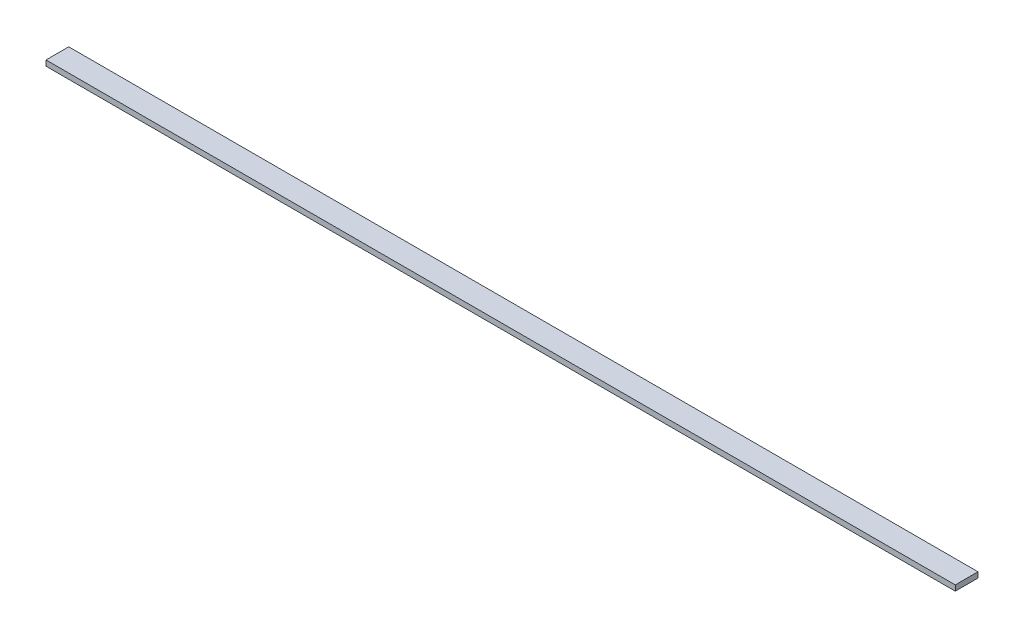
ISO-10303-21;
HEADER;
FILE_DESCRIPTION(('STEP AP214'),'2;1');
FILE_NAME('part.step','',(''),(''),'','','');
FILE_SCHEMA(('AUTOMOTIVE_DESIGN { 1 0 10303 214 1 1 1 1 }'));
ENDSEC;
DATA;
#1=APPLICATION_CONTEXT('core data for automotive mechanical design processes');
#2=APPLICATION_PROTOCOL_DEFINITION('international standard','automotive_design',2000,#1);
#3=PRODUCT_CONTEXT('',#1,'mechanical');
#4=PRODUCT('Part','Part','',(#3));
#5=PRODUCT_RELATED_PRODUCT_CATEGORY('part','',(#4));
#6=PRODUCT_DEFINITION_FORMATION('','',#4);
#7=PRODUCT_DEFINITION_CONTEXT('part definition',#1,'design');
#8=PRODUCT_DEFINITION('design','',#6,#7);
#9=PRODUCT_DEFINITION_SHAPE('','',#8);
#10=(LENGTH_UNIT() NAMED_UNIT(*) SI_UNIT(.MILLI.,.METRE.));
#11=(NAMED_UNIT(*) PLANE_ANGLE_UNIT() SI_UNIT($,.RADIAN.));
#12=(NAMED_UNIT(*) SI_UNIT($,.STERADIAN.) SOLID_ANGLE_UNIT());
#13=UNCERTAINTY_MEASURE_WITH_UNIT(LENGTH_MEASURE(1.E-05),#10,'distance_accuracy_value','');
#14=(GEOMETRIC_REPRESENTATION_CONTEXT(3) GLOBAL_UNCERTAINTY_ASSIGNED_CONTEXT((#13)) GLOBAL_UNIT_ASSIGNED_CONTEXT((#10,
#11,#12)) REPRESENTATION_CONTEXT('',''));
#15=CARTESIAN_POINT('',(0.,0.,0.));
#16=DIRECTION('',(0.,0.,1.));
#17=DIRECTION('',(1.,0.,0.));
#18=AXIS2_PLACEMENT_3D('',#15,#16,#17);
#19=CARTESIAN_POINT('',(-75.9433007859229,6.,-31.6632072793595));
#20=DIRECTION('',(1.,0.,0.));
#21=DIRECTION('',(0.,0.,-1.));
#22=AXIS2_PLACEMENT_3D('',#19,#20,#21);
#23=PLANE('',#22);
#24=DIRECTION('',(0.,0.,1.));
#25=VECTOR('',#24,1.);
#26=CARTESIAN_POINT('',(-75.9433007859229,0.,-31.6632072793595));
#27=LINE('',#26,#25);
#28=CARTESIAN_POINT('',(-75.9433007859229,0.,-31.6632072793595));
#29=VERTEX_POINT('',#28);
#30=CARTESIAN_POINT('',(-75.9433007859229,0.,-6.66320727935954));
#31=VERTEX_POINT('',#30);
#32=EDGE_CURVE('E96',#29,#31,#27,.T.);
#33=ORIENTED_EDGE('',*,*,#32,.T.);
#34=DIRECTION('',(0.,-1.,0.));
#35=VECTOR('',#34,1.);
#36=CARTESIAN_POINT('',(-75.9433007859229,6.,-6.66320727935954));
#37=LINE('',#36,#35);
#38=CARTESIAN_POINT('',(-75.9433007859229,6.,-6.66320727935954));
#39=VERTEX_POINT('',#38);
#40=EDGE_CURVE('E11',#39,#31,#37,.T.);
#41=ORIENTED_EDGE('',*,*,#40,.F.);
#42=DIRECTION('',(0.,0.,1.));
#43=VECTOR('',#42,1.);
#44=CARTESIAN_POINT('',(-75.9433007859229,6.,-31.6632072793595));
#45=LINE('',#44,#43);
#46=CARTESIAN_POINT('',(-75.9433007859229,6.,-31.6632072793595));
#47=VERTEX_POINT('',#46);
#48=EDGE_CURVE('E84',#47,#39,#45,.T.);
#49=ORIENTED_EDGE('',*,*,#48,.F.);
#50=DIRECTION('',(0.,-1.,0.));
#51=VECTOR('',#50,1.);
#52=CARTESIAN_POINT('',(-75.9433007859229,6.,-31.6632072793595));
#53=LINE('',#52,#51);
#54=EDGE_CURVE('E92',#47,#29,#53,.T.);
#55=ORIENTED_EDGE('',*,*,#54,.T.);
#56=EDGE_LOOP('',(#33,#41,#49,#55));
#57=FACE_BOUND('',#56,.T.);
#58=ADVANCED_FACE('F33',(#57),#23,.F.);
#59=CARTESIAN_POINT('',(-75.9433007859229,6.,-6.66320727935954));
#60=DIRECTION('',(0.,0.,-1.));
#61=DIRECTION('',(-1.,0.,0.));
#62=AXIS2_PLACEMENT_3D('',#59,#60,#61);
#63=PLANE('',#62);
#64=DIRECTION('',(1.,0.,0.));
#65=VECTOR('',#64,1.);
#66=CARTESIAN_POINT('',(-75.9433007859229,0.,-6.66320727935954));
#67=LINE('',#66,#65);
#68=CARTESIAN_POINT('',(924.056699214077,0.,-6.66320727935954));
#69=VERTEX_POINT('',#68);
#70=EDGE_CURVE('E88',#31,#69,#67,.T.);
#71=ORIENTED_EDGE('',*,*,#70,.T.);
#72=DIRECTION('',(0.,-1.,0.));
#73=VECTOR('',#72,1.);
#74=CARTESIAN_POINT('',(924.056699214077,6.,-6.66320727935954));
#75=LINE('',#74,#73);
#76=CARTESIAN_POINT('',(924.056699214077,6.,-6.66320727935954));
#77=VERTEX_POINT('',#76);
#78=EDGE_CURVE('E41',#77,#69,#75,.T.);
#79=ORIENTED_EDGE('',*,*,#78,.F.);
#80=DIRECTION('',(1.,0.,0.));
#81=VECTOR('',#80,1.);
#82=CARTESIAN_POINT('',(-75.9433007859229,6.,-6.66320727935954));
#83=LINE('',#82,#81);
#84=EDGE_CURVE('E79',#39,#77,#83,.T.);
#85=ORIENTED_EDGE('',*,*,#84,.F.);
#86=ORIENTED_EDGE('',*,*,#40,.T.);
#87=EDGE_LOOP('',(#71,#79,#85,#86));
#88=FACE_BOUND('',#87,.T.);
#89=ADVANCED_FACE('F87',(#88),#63,.F.);
#90=CARTESIAN_POINT('',(924.056699214077,6.,-31.6632072793595));
#91=DIRECTION('',(-1.,0.,0.));
#92=DIRECTION('',(0.,0.,1.));
#93=AXIS2_PLACEMENT_3D('',#90,#91,#92);
#94=PLANE('',#93);
#95=DIRECTION('',(0.,0.,-1.));
#96=VECTOR('',#95,1.);
#97=CARTESIAN_POINT('',(924.056699214077,0.,-31.6632072793595));
#98=LINE('',#97,#96);
#99=CARTESIAN_POINT('',(924.056699214077,0.,-31.6632072793595));
#100=VERTEX_POINT('',#99);
#101=EDGE_CURVE('E66',#69,#100,#98,.T.);
#102=ORIENTED_EDGE('',*,*,#101,.T.);
#103=DIRECTION('',(0.,-1.,0.));
#104=VECTOR('',#103,1.);
#105=CARTESIAN_POINT('',(924.056699214077,6.,-31.6632072793595));
#106=LINE('',#105,#104);
#107=CARTESIAN_POINT('',(924.056699214077,6.,-31.6632072793595));
#108=VERTEX_POINT('',#107);
#109=EDGE_CURVE('E89',#108,#100,#106,.T.);
#110=ORIENTED_EDGE('',*,*,#109,.F.);
#111=DIRECTION('',(0.,0.,-1.));
#112=VECTOR('',#111,1.);
#113=CARTESIAN_POINT('',(924.056699214077,6.,-31.6632072793595));
#114=LINE('',#113,#112);
#115=EDGE_CURVE('E82',#77,#108,#114,.T.);
#116=ORIENTED_EDGE('',*,*,#115,.F.);
#117=ORIENTED_EDGE('',*,*,#78,.T.);
#118=EDGE_LOOP('',(#102,#110,#116,#117));
#119=FACE_BOUND('',#118,.T.);
#120=ADVANCED_FACE('F90',(#119),#94,.F.);
#121=CARTESIAN_POINT('',(-75.9433007859229,6.,-31.6632072793595));
#122=DIRECTION('',(0.,0.,1.));
#123=DIRECTION('',(1.,0.,0.));
#124=AXIS2_PLACEMENT_3D('',#121,#122,#123);
#125=PLANE('',#124);
#126=DIRECTION('',(-1.,0.,0.));
#127=VECTOR('',#126,1.);
#128=CARTESIAN_POINT('',(-75.9433007859229,0.,-31.6632072793595));
#129=LINE('',#128,#127);
#130=EDGE_CURVE('E72',#100,#29,#129,.T.);
#131=ORIENTED_EDGE('',*,*,#130,.T.);
#132=ORIENTED_EDGE('',*,*,#54,.F.);
#133=DIRECTION('',(-1.,0.,0.));
#134=VECTOR('',#133,1.);
#135=CARTESIAN_POINT('',(-75.9433007859229,6.,-31.6632072793595));
#136=LINE('',#135,#134);
#137=EDGE_CURVE('E49',#108,#47,#136,.T.);
#138=ORIENTED_EDGE('',*,*,#137,.F.);
#139=ORIENTED_EDGE('',*,*,#109,.T.);
#140=EDGE_LOOP('',(#131,#132,#138,#139));
#141=FACE_BOUND('',#140,.T.);
#142=ADVANCED_FACE('F103',(#141),#125,.F.);
#143=CARTESIAN_POINT('',(0.,6.,0.));
#144=DIRECTION('',(0.,1.,0.));
#145=DIRECTION('',(0.,0.,1.));
#146=AXIS2_PLACEMENT_3D('',#143,#144,#145);
#147=PLANE('',#146);
#148=ORIENTED_EDGE('',*,*,#48,.T.);
#149=ORIENTED_EDGE('',*,*,#84,.T.);
#150=ORIENTED_EDGE('',*,*,#115,.T.);
#151=ORIENTED_EDGE('',*,*,#137,.T.);
#152=EDGE_LOOP('',(#148,#149,#150,#151));
#153=FACE_BOUND('',#152,.T.);
#154=ADVANCED_FACE('F80',(#153),#147,.T.);
#155=CARTESIAN_POINT('',(0.,0.,0.));
#156=DIRECTION('',(0.,1.,0.));
#157=DIRECTION('',(0.,0.,1.));
#158=AXIS2_PLACEMENT_3D('',#155,#156,#157);
#159=PLANE('',#158);
#160=ORIENTED_EDGE('',*,*,#32,.F.);
#161=ORIENTED_EDGE('',*,*,#130,.F.);
#162=ORIENTED_EDGE('',*,*,#101,.F.);
#163=ORIENTED_EDGE('',*,*,#70,.F.);
#164=EDGE_LOOP('',(#160,#161,#162,#163));
#165=FACE_BOUND('',#164,.T.);
#166=ADVANCED_FACE('F106',(#165),#159,.F.);
#167=CLOSED_SHELL('',(#58,#89,#120,#142,#154,#166));
#168=MANIFOLD_SOLID_BREP('B2',#167);
#169=ADVANCED_BREP_SHAPE_REPRESENTATION('',(#18,#168),#14);
#170=SHAPE_DEFINITION_REPRESENTATION(#9,#169);
ENDSEC;
END-ISO-10303-21;
